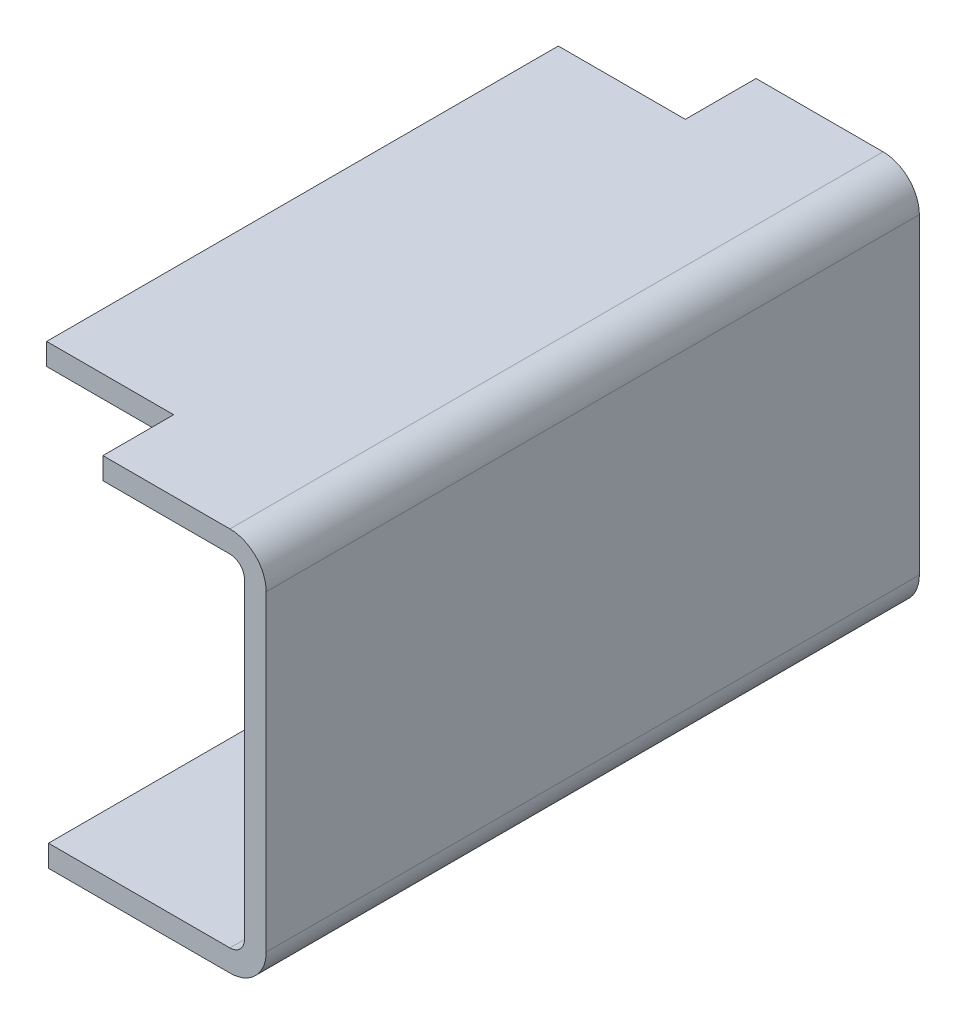
ISO-10303-21;
HEADER;
FILE_DESCRIPTION(('STEP AP214'),'2;1');
FILE_NAME('part.step','',(''),(''),'','','');
FILE_SCHEMA(('AUTOMOTIVE_DESIGN { 1 0 10303 214 1 1 1 1 }'));
ENDSEC;
DATA;
#1=APPLICATION_CONTEXT('core data for automotive mechanical design processes');
#2=APPLICATION_PROTOCOL_DEFINITION('international standard','automotive_design',2000,#1);
#3=PRODUCT_CONTEXT('',#1,'mechanical');
#4=PRODUCT('Part','Part','',(#3));
#5=PRODUCT_RELATED_PRODUCT_CATEGORY('part','',(#4));
#6=PRODUCT_DEFINITION_FORMATION('','',#4);
#7=PRODUCT_DEFINITION_CONTEXT('part definition',#1,'design');
#8=PRODUCT_DEFINITION('design','',#6,#7);
#9=PRODUCT_DEFINITION_SHAPE('','',#8);
#10=(LENGTH_UNIT() NAMED_UNIT(*) SI_UNIT(.MILLI.,.METRE.));
#11=(NAMED_UNIT(*) PLANE_ANGLE_UNIT() SI_UNIT($,.RADIAN.));
#12=(NAMED_UNIT(*) SI_UNIT($,.STERADIAN.) SOLID_ANGLE_UNIT());
#13=UNCERTAINTY_MEASURE_WITH_UNIT(LENGTH_MEASURE(1.E-05),#10,'distance_accuracy_value','');
#14=(GEOMETRIC_REPRESENTATION_CONTEXT(3) GLOBAL_UNCERTAINTY_ASSIGNED_CONTEXT((#13)) GLOBAL_UNIT_ASSIGNED_CONTEXT((#10,
#11,#12)) REPRESENTATION_CONTEXT('',''));
#15=CARTESIAN_POINT('',(0.,0.,0.));
#16=DIRECTION('',(0.,0.,1.));
#17=DIRECTION('',(1.,0.,0.));
#18=AXIS2_PLACEMENT_3D('',#15,#16,#17);
#19=CARTESIAN_POINT('',(3.241785919053,2.18,3.542305203826));
#20=DIRECTION('',(0.,0.,-1.));
#21=DIRECTION('',(0.,1.,0.));
#22=AXIS2_PLACEMENT_3D('',#19,#20,#21);
#23=CYLINDRICAL_SURFACE('',#22,0.05);
#24=CARTESIAN_POINT('',(3.241785919053,2.18,3.542305203826));
#25=DIRECTION('',(0.,0.,-1.));
#26=DIRECTION('',(0.,1.,0.));
#27=AXIS2_PLACEMENT_3D('',#24,#25,#26);
#28=CIRCLE('',#27,0.05);
#29=CARTESIAN_POINT('',(3.241785919053,2.23,3.542305203826));
#30=VERTEX_POINT('',#29);
#31=CARTESIAN_POINT('',(3.291785919053,2.18,3.542305203826));
#32=VERTEX_POINT('',#31);
#33=EDGE_CURVE('E187',#30,#32,#28,.T.);
#34=ORIENTED_EDGE('',*,*,#33,.T.);
#35=DIRECTION('',(0.,0.,-1.));
#36=VECTOR('',#35,1.);
#37=CARTESIAN_POINT('',(3.291785919053,2.18,3.542305203826));
#38=LINE('',#37,#36);
#39=CARTESIAN_POINT('',(3.291785919053,2.18,2.642305203826));
#40=VERTEX_POINT('',#39);
#41=EDGE_CURVE('E11',#32,#40,#38,.T.);
#42=ORIENTED_EDGE('',*,*,#41,.T.);
#43=CARTESIAN_POINT('',(3.241785919053,2.18,2.642305203826));
#44=DIRECTION('',(0.,0.,-1.));
#45=DIRECTION('',(0.,1.,0.));
#46=AXIS2_PLACEMENT_3D('',#43,#44,#45);
#47=CIRCLE('',#46,0.05);
#48=CARTESIAN_POINT('',(3.241785919053,2.23,2.642305203826));
#49=VERTEX_POINT('',#48);
#50=EDGE_CURVE('E258',#49,#40,#47,.T.);
#51=ORIENTED_EDGE('',*,*,#50,.F.);
#52=DIRECTION('',(0.,0.,-1.));
#53=VECTOR('',#52,1.);
#54=CARTESIAN_POINT('',(3.241785919053,2.23,3.542305203826));
#55=LINE('',#54,#53);
#56=EDGE_CURVE('E178',#30,#49,#55,.T.);
#57=ORIENTED_EDGE('',*,*,#56,.F.);
#58=EDGE_LOOP('',(#34,#42,#51,#57));
#59=FACE_BOUND('',#58,.T.);
#60=ADVANCED_FACE('F17',(#59),#23,.T.);
#61=CARTESIAN_POINT('',(3.291785919053,2.18,3.542305203826));
#62=DIRECTION('',(1.,0.,0.));
#63=DIRECTION('',(0.,-1.,0.));
#64=AXIS2_PLACEMENT_3D('',#61,#62,#63);
#65=PLANE('',#64);
#66=DIRECTION('',(0.,-1.,0.));
#67=VECTOR('',#66,1.);
#68=CARTESIAN_POINT('',(3.291785919053,2.18,3.542305203826));
#69=LINE('',#68,#67);
#70=CARTESIAN_POINT('',(3.291785919053,1.75,3.542305203826));
#71=VERTEX_POINT('',#70);
#72=EDGE_CURVE('E206',#32,#71,#69,.T.);
#73=ORIENTED_EDGE('',*,*,#72,.T.);
#74=DIRECTION('',(0.,0.,-1.));
#75=VECTOR('',#74,1.);
#76=CARTESIAN_POINT('',(3.291785919053,1.75,3.542305203826));
#77=LINE('',#76,#75);
#78=CARTESIAN_POINT('',(3.291785919053,1.75,2.642305203826));
#79=VERTEX_POINT('',#78);
#80=EDGE_CURVE('E20',#71,#79,#77,.T.);
#81=ORIENTED_EDGE('',*,*,#80,.T.);
#82=DIRECTION('',(0.,-1.,0.));
#83=VECTOR('',#82,1.);
#84=CARTESIAN_POINT('',(3.291785919053,2.18,2.642305203826));
#85=LINE('',#84,#83);
#86=EDGE_CURVE('E253',#40,#79,#85,.T.);
#87=ORIENTED_EDGE('',*,*,#86,.F.);
#88=ORIENTED_EDGE('',*,*,#41,.F.);
#89=EDGE_LOOP('',(#73,#81,#87,#88));
#90=FACE_BOUND('',#89,.T.);
#91=ADVANCED_FACE('F377',(#90),#65,.T.);
#92=CARTESIAN_POINT('',(3.241785919053,1.75,3.542305203826));
#93=DIRECTION('',(0.,0.,-1.));
#94=DIRECTION('',(1.,0.,0.));
#95=AXIS2_PLACEMENT_3D('',#92,#93,#94);
#96=CYLINDRICAL_SURFACE('',#95,0.05);
#97=CARTESIAN_POINT('',(3.241785919053,1.75,3.542305203826));
#98=DIRECTION('',(0.,0.,-1.));
#99=DIRECTION('',(1.,0.,0.));
#100=AXIS2_PLACEMENT_3D('',#97,#98,#99);
#101=CIRCLE('',#100,0.05);
#102=CARTESIAN_POINT('',(3.241785919053,1.7,3.542305203826));
#103=VERTEX_POINT('',#102);
#104=EDGE_CURVE('E210',#71,#103,#101,.T.);
#105=ORIENTED_EDGE('',*,*,#104,.T.);
#106=DIRECTION('',(0.,0.,-1.));
#107=VECTOR('',#106,1.);
#108=CARTESIAN_POINT('',(3.241785919053,1.7,3.542305203826));
#109=LINE('',#108,#107);
#110=CARTESIAN_POINT('',(3.241785919053,1.7,2.642305203826));
#111=VERTEX_POINT('',#110);
#112=EDGE_CURVE('E262',#103,#111,#109,.T.);
#113=ORIENTED_EDGE('',*,*,#112,.T.);
#114=CARTESIAN_POINT('',(3.241785919053,1.75,2.642305203826));
#115=DIRECTION('',(0.,0.,-1.));
#116=DIRECTION('',(1.,0.,0.));
#117=AXIS2_PLACEMENT_3D('',#114,#115,#116);
#118=CIRCLE('',#117,0.05);
#119=EDGE_CURVE('E257',#79,#111,#118,.T.);
#120=ORIENTED_EDGE('',*,*,#119,.F.);
#121=ORIENTED_EDGE('',*,*,#80,.F.);
#122=EDGE_LOOP('',(#105,#113,#120,#121));
#123=FACE_BOUND('',#122,.T.);
#124=ADVANCED_FACE('F382',(#123),#96,.T.);
#125=CARTESIAN_POINT('',(3.241785919053,1.7,3.542305203826));
#126=DIRECTION('',(0.,-1.,0.));
#127=DIRECTION('',(-1.,0.,0.));
#128=AXIS2_PLACEMENT_3D('',#125,#126,#127);
#129=PLANE('',#128);
#130=DIRECTION('',(-1.,0.,0.));
#131=VECTOR('',#130,1.);
#132=CARTESIAN_POINT('',(3.241785919053,1.7,3.542305203826));
#133=LINE('',#132,#131);
#134=CARTESIAN_POINT('',(2.991785919053,1.7,3.542305203826));
#135=VERTEX_POINT('',#134);
#136=EDGE_CURVE('E215',#103,#135,#133,.T.);
#137=ORIENTED_EDGE('',*,*,#136,.T.);
#138=DIRECTION('',(0.,0.,-1.));
#139=VECTOR('',#138,1.);
#140=CARTESIAN_POINT('',(2.991785919053,1.7,3.542305203826));
#141=LINE('',#140,#139);
#142=CARTESIAN_POINT('',(2.991785919053,1.7,2.642305203826));
#143=VERTEX_POINT('',#142);
#144=EDGE_CURVE('E248',#135,#143,#141,.T.);
#145=ORIENTED_EDGE('',*,*,#144,.T.);
#146=DIRECTION('',(-1.,0.,0.));
#147=VECTOR('',#146,1.);
#148=CARTESIAN_POINT('',(3.241785919053,1.7,2.642305203826));
#149=LINE('',#148,#147);
#150=EDGE_CURVE('E273',#111,#143,#149,.T.);
#151=ORIENTED_EDGE('',*,*,#150,.F.);
#152=ORIENTED_EDGE('',*,*,#112,.F.);
#153=EDGE_LOOP('',(#137,#145,#151,#152));
#154=FACE_BOUND('',#153,.T.);
#155=ADVANCED_FACE('F385',(#154),#129,.T.);
#156=CARTESIAN_POINT('',(2.991785919053,1.7,3.542305203826));
#157=DIRECTION('',(-1.,0.,0.));
#158=DIRECTION('',(0.,0.,1.));
#159=AXIS2_PLACEMENT_3D('',#156,#157,#158);
#160=PLANE('',#159);
#161=DIRECTION('',(0.,1.,0.));
#162=VECTOR('',#161,1.);
#163=CARTESIAN_POINT('',(2.991785919053,1.7,3.542305203826));
#164=LINE('',#163,#162);
#165=CARTESIAN_POINT('',(2.991785919053,1.73,3.542305203826));
#166=VERTEX_POINT('',#165);
#167=EDGE_CURVE('E219',#135,#166,#164,.T.);
#168=ORIENTED_EDGE('',*,*,#167,.T.);
#169=DIRECTION('',(0.,0.,-1.));
#170=VECTOR('',#169,1.);
#171=CARTESIAN_POINT('',(2.991785919053,1.73,3.542305203826));
#172=LINE('',#171,#170);
#173=CARTESIAN_POINT('',(2.991785919053,1.73,2.642305203826));
#174=VERTEX_POINT('',#173);
#175=EDGE_CURVE('E245',#166,#174,#172,.T.);
#176=ORIENTED_EDGE('',*,*,#175,.T.);
#177=DIRECTION('',(0.,1.,0.));
#178=VECTOR('',#177,1.);
#179=CARTESIAN_POINT('',(2.991785919053,1.7,2.642305203826));
#180=LINE('',#179,#178);
#181=EDGE_CURVE('E277',#143,#174,#180,.T.);
#182=ORIENTED_EDGE('',*,*,#181,.F.);
#183=ORIENTED_EDGE('',*,*,#144,.F.);
#184=EDGE_LOOP('',(#168,#176,#182,#183));
#185=FACE_BOUND('',#184,.T.);
#186=ADVANCED_FACE('F388',(#185),#160,.T.);
#187=CARTESIAN_POINT('',(2.991785919053,1.73,3.542305203826));
#188=DIRECTION('',(0.,1.,0.));
#189=DIRECTION('',(1.,0.,0.));
#190=AXIS2_PLACEMENT_3D('',#187,#188,#189);
#191=PLANE('',#190);
#192=DIRECTION('',(1.,0.,0.));
#193=VECTOR('',#192,1.);
#194=CARTESIAN_POINT('',(2.991785919053,1.73,3.542305203826));
#195=LINE('',#194,#193);
#196=CARTESIAN_POINT('',(3.241785919053,1.73,3.542305203826));
#197=VERTEX_POINT('',#196);
#198=EDGE_CURVE('E235',#166,#197,#195,.T.);
#199=ORIENTED_EDGE('',*,*,#198,.T.);
#200=DIRECTION('',(0.,0.,-1.));
#201=VECTOR('',#200,1.);
#202=CARTESIAN_POINT('',(3.241785919053,1.73,3.542305203826));
#203=LINE('',#202,#201);
#204=CARTESIAN_POINT('',(3.241785919053,1.73,2.642305203826));
#205=VERTEX_POINT('',#204);
#206=EDGE_CURVE('E249',#197,#205,#203,.T.);
#207=ORIENTED_EDGE('',*,*,#206,.T.);
#208=DIRECTION('',(1.,0.,0.));
#209=VECTOR('',#208,1.);
#210=CARTESIAN_POINT('',(2.991785919053,1.73,2.642305203826));
#211=LINE('',#210,#209);
#212=EDGE_CURVE('E281',#174,#205,#211,.T.);
#213=ORIENTED_EDGE('',*,*,#212,.F.);
#214=ORIENTED_EDGE('',*,*,#175,.F.);
#215=EDGE_LOOP('',(#199,#207,#213,#214));
#216=FACE_BOUND('',#215,.T.);
#217=ADVANCED_FACE('F362',(#216),#191,.T.);
#218=CARTESIAN_POINT('',(3.241785919053,1.75,3.542305203826));
#219=DIRECTION('',(0.,0.,1.));
#220=DIRECTION('',(0.,-1.,0.));
#221=AXIS2_PLACEMENT_3D('',#218,#219,#220);
#222=CYLINDRICAL_SURFACE('',#221,0.02);
#223=CARTESIAN_POINT('',(3.241785919053,1.75,3.542305203826));
#224=DIRECTION('',(0.,0.,1.));
#225=DIRECTION('',(0.,-1.,0.));
#226=AXIS2_PLACEMENT_3D('',#223,#224,#225);
#227=CIRCLE('',#226,0.02);
#228=CARTESIAN_POINT('',(3.261785919053,1.75,3.542305203826));
#229=VERTEX_POINT('',#228);
#230=EDGE_CURVE('E227',#197,#229,#227,.T.);
#231=ORIENTED_EDGE('',*,*,#230,.T.);
#232=DIRECTION('',(0.,0.,-1.));
#233=VECTOR('',#232,1.);
#234=CARTESIAN_POINT('',(3.261785919053,1.75,3.542305203826));
#235=LINE('',#234,#233);
#236=CARTESIAN_POINT('',(3.261785919053,1.75,2.642305203826));
#237=VERTEX_POINT('',#236);
#238=EDGE_CURVE('E342',#229,#237,#235,.T.);
#239=ORIENTED_EDGE('',*,*,#238,.T.);
#240=CARTESIAN_POINT('',(3.241785919053,1.75,2.642305203826));
#241=DIRECTION('',(0.,0.,1.));
#242=DIRECTION('',(0.,-1.,0.));
#243=AXIS2_PLACEMENT_3D('',#240,#241,#242);
#244=CIRCLE('',#243,0.02);
#245=EDGE_CURVE('E288',#205,#237,#244,.T.);
#246=ORIENTED_EDGE('',*,*,#245,.F.);
#247=ORIENTED_EDGE('',*,*,#206,.F.);
#248=EDGE_LOOP('',(#231,#239,#246,#247));
#249=FACE_BOUND('',#248,.T.);
#250=ADVANCED_FACE('F350',(#249),#222,.F.);
#251=CARTESIAN_POINT('',(3.261785919053,1.75,3.542305203826));
#252=DIRECTION('',(-1.,0.,0.));
#253=DIRECTION('',(0.,0.,1.));
#254=AXIS2_PLACEMENT_3D('',#251,#252,#253);
#255=PLANE('',#254);
#256=DIRECTION('',(0.,1.,0.));
#257=VECTOR('',#256,1.);
#258=CARTESIAN_POINT('',(3.261785919053,1.75,3.542305203826));
#259=LINE('',#258,#257);
#260=CARTESIAN_POINT('',(3.261785919053,2.18,3.542305203826));
#261=VERTEX_POINT('',#260);
#262=EDGE_CURVE('E223',#229,#261,#259,.T.);
#263=ORIENTED_EDGE('',*,*,#262,.T.);
#264=DIRECTION('',(0.,0.,-1.));
#265=VECTOR('',#264,1.);
#266=CARTESIAN_POINT('',(3.261785919053,2.18,3.542305203826));
#267=LINE('',#266,#265);
#268=CARTESIAN_POINT('',(3.261785919053,2.18,2.642305203826));
#269=VERTEX_POINT('',#268);
#270=EDGE_CURVE('E338',#261,#269,#267,.T.);
#271=ORIENTED_EDGE('',*,*,#270,.T.);
#272=DIRECTION('',(0.,1.,0.));
#273=VECTOR('',#272,1.);
#274=CARTESIAN_POINT('',(3.261785919053,1.75,2.642305203826));
#275=LINE('',#274,#273);
#276=EDGE_CURVE('E292',#237,#269,#275,.T.);
#277=ORIENTED_EDGE('',*,*,#276,.F.);
#278=ORIENTED_EDGE('',*,*,#238,.F.);
#279=EDGE_LOOP('',(#263,#271,#277,#278));
#280=FACE_BOUND('',#279,.T.);
#281=ADVANCED_FACE('F354',(#280),#255,.T.);
#282=CARTESIAN_POINT('',(3.241785919053,2.18,3.542305203826));
#283=DIRECTION('',(0.,0.,1.));
#284=DIRECTION('',(1.,0.,0.));
#285=AXIS2_PLACEMENT_3D('',#282,#283,#284);
#286=CYLINDRICAL_SURFACE('',#285,0.02);
#287=CARTESIAN_POINT('',(3.241785919053,2.18,3.542305203826));
#288=DIRECTION('',(0.,0.,1.));
#289=DIRECTION('',(1.,0.,0.));
#290=AXIS2_PLACEMENT_3D('',#287,#288,#289);
#291=CIRCLE('',#290,0.02);
#292=CARTESIAN_POINT('',(3.241785919053,2.2,3.542305203826));
#293=VERTEX_POINT('',#292);
#294=EDGE_CURVE('E202',#261,#293,#291,.T.);
#295=ORIENTED_EDGE('',*,*,#294,.T.);
#296=DIRECTION('',(0.,0.,-1.));
#297=VECTOR('',#296,1.);
#298=CARTESIAN_POINT('',(3.241785919053,2.2,3.542305203826));
#299=LINE('',#298,#297);
#300=CARTESIAN_POINT('',(3.241785919053,2.2,2.642305203826));
#301=VERTEX_POINT('',#300);
#302=EDGE_CURVE('E214',#293,#301,#299,.T.);
#303=ORIENTED_EDGE('',*,*,#302,.T.);
#304=CARTESIAN_POINT('',(3.241785919053,2.18,2.642305203826));
#305=DIRECTION('',(0.,0.,1.));
#306=DIRECTION('',(1.,0.,0.));
#307=AXIS2_PLACEMENT_3D('',#304,#305,#306);
#308=CIRCLE('',#307,0.02);
#309=EDGE_CURVE('E296',#269,#301,#308,.T.);
#310=ORIENTED_EDGE('',*,*,#309,.F.);
#311=ORIENTED_EDGE('',*,*,#270,.F.);
#312=EDGE_LOOP('',(#295,#303,#310,#311));
#313=FACE_BOUND('',#312,.T.);
#314=ADVANCED_FACE('F367',(#313),#286,.F.);
#315=CARTESIAN_POINT('',(1.816785919053,2.2,2.739805203826));
#316=DIRECTION('',(0.,0.,1.));
#317=DIRECTION('',(1.,0.,0.));
#318=AXIS2_PLACEMENT_3D('',#315,#316,#317);
#319=PLANE('',#318);
#320=DIRECTION('',(1.,0.,0.));
#321=VECTOR('',#320,1.);
#322=CARTESIAN_POINT('',(2.891785919053,2.23,2.739805203826));
#323=LINE('',#322,#321);
#324=CARTESIAN_POINT('',(2.891785919053,2.23,2.739805203826));
#325=VERTEX_POINT('',#324);
#326=CARTESIAN_POINT('',(3.066785919053,2.23,2.739805203826));
#327=VERTEX_POINT('',#326);
#328=EDGE_CURVE('E284',#325,#327,#323,.T.);
#329=ORIENTED_EDGE('',*,*,#328,.T.);
#330=DIRECTION('',(0.,1.,0.));
#331=VECTOR('',#330,1.);
#332=CARTESIAN_POINT('',(3.066785919053,2.2,2.739805203826));
#333=LINE('',#332,#331);
#334=CARTESIAN_POINT('',(3.066785919053,2.2,2.739805203826));
#335=VERTEX_POINT('',#334);
#336=EDGE_CURVE('E48',#335,#327,#333,.T.);
#337=ORIENTED_EDGE('',*,*,#336,.F.);
#338=DIRECTION('',(-1.,0.,0.));
#339=VECTOR('',#338,1.);
#340=CARTESIAN_POINT('',(3.066785919053,2.2,2.739805203826));
#341=LINE('',#340,#339);
#342=CARTESIAN_POINT('',(2.891785919053,2.2,2.739805203826));
#343=VERTEX_POINT('',#342);
#344=EDGE_CURVE('E323',#335,#343,#341,.T.);
#345=ORIENTED_EDGE('',*,*,#344,.T.);
#346=DIRECTION('',(0.,1.,0.));
#347=VECTOR('',#346,1.);
#348=CARTESIAN_POINT('',(2.891785919053,2.2,2.739805203826));
#349=LINE('',#348,#347);
#350=EDGE_CURVE('E307',#343,#325,#349,.T.);
#351=ORIENTED_EDGE('',*,*,#350,.T.);
#352=EDGE_LOOP('',(#329,#337,#345,#351));
#353=FACE_BOUND('',#352,.T.);
#354=ADVANCED_FACE('F429',(#353),#319,.F.);
#355=CARTESIAN_POINT('',(3.066785919053,2.2,3.542305203826));
#356=DIRECTION('',(1.,0.,0.));
#357=DIRECTION('',(0.,-1.,0.));
#358=AXIS2_PLACEMENT_3D('',#355,#356,#357);
#359=PLANE('',#358);
#360=DIRECTION('',(0.,0.,-1.));
#361=VECTOR('',#360,1.);
#362=CARTESIAN_POINT('',(3.066785919053,2.23,3.542305203826));
#363=LINE('',#362,#361);
#364=CARTESIAN_POINT('',(3.066785919053,2.23,2.642305203826));
#365=VERTEX_POINT('',#364);
#366=EDGE_CURVE('E239',#327,#365,#363,.T.);
#367=ORIENTED_EDGE('',*,*,#366,.T.);
#368=DIRECTION('',(0.,-1.,0.));
#369=VECTOR('',#368,1.);
#370=CARTESIAN_POINT('',(3.066785919053,2.2,2.642305203826));
#371=LINE('',#370,#369);
#372=CARTESIAN_POINT('',(3.066785919053,2.2,2.642305203826));
#373=VERTEX_POINT('',#372);
#374=EDGE_CURVE('E189',#365,#373,#371,.T.);
#375=ORIENTED_EDGE('',*,*,#374,.T.);
#376=DIRECTION('',(0.,0.,1.));
#377=VECTOR('',#376,1.);
#378=CARTESIAN_POINT('',(3.066785919053,2.2,3.542305203826));
#379=LINE('',#378,#377);
#380=EDGE_CURVE('E326',#373,#335,#379,.T.);
#381=ORIENTED_EDGE('',*,*,#380,.T.);
#382=ORIENTED_EDGE('',*,*,#336,.T.);
#383=EDGE_LOOP('',(#367,#375,#381,#382));
#384=FACE_BOUND('',#383,.T.);
#385=ADVANCED_FACE('F370',(#384),#359,.F.);
#386=CARTESIAN_POINT('',(3.066785919053,2.2,3.542305203826));
#387=DIRECTION('',(1.,0.,0.));
#388=DIRECTION('',(0.,-1.,0.));
#389=AXIS2_PLACEMENT_3D('',#386,#387,#388);
#390=PLANE('',#389);
#391=DIRECTION('',(0.,0.,-1.));
#392=VECTOR('',#391,1.);
#393=CARTESIAN_POINT('',(3.066785919053,2.23,3.542305203826));
#394=LINE('',#393,#392);
#395=CARTESIAN_POINT('',(3.066785919053,2.23,3.542305203826));
#396=VERTEX_POINT('',#395);
#397=CARTESIAN_POINT('',(3.066785919053,2.23,3.444805203826));
#398=VERTEX_POINT('',#397);
#399=EDGE_CURVE('E168',#396,#398,#394,.T.);
#400=ORIENTED_EDGE('',*,*,#399,.T.);
#401=DIRECTION('',(0.,1.,0.));
#402=VECTOR('',#401,1.);
#403=CARTESIAN_POINT('',(3.066785919053,2.2,3.444805203826));
#404=LINE('',#403,#402);
#405=CARTESIAN_POINT('',(3.066785919053,2.2,3.444805203826));
#406=VERTEX_POINT('',#405);
#407=EDGE_CURVE('E38',#406,#398,#404,.T.);
#408=ORIENTED_EDGE('',*,*,#407,.F.);
#409=DIRECTION('',(0.,0.,1.));
#410=VECTOR('',#409,1.);
#411=CARTESIAN_POINT('',(3.066785919053,2.2,3.444805203826));
#412=LINE('',#411,#410);
#413=CARTESIAN_POINT('',(3.066785919053,2.2,3.542305203826));
#414=VERTEX_POINT('',#413);
#415=EDGE_CURVE('E193',#406,#414,#412,.T.);
#416=ORIENTED_EDGE('',*,*,#415,.T.);
#417=DIRECTION('',(0.,-1.,0.));
#418=VECTOR('',#417,1.);
#419=CARTESIAN_POINT('',(3.066785919053,2.23,3.542305203826));
#420=LINE('',#419,#418);
#421=EDGE_CURVE('E184',#396,#414,#420,.T.);
#422=ORIENTED_EDGE('',*,*,#421,.F.);
#423=EDGE_LOOP('',(#400,#408,#416,#422));
#424=FACE_BOUND('',#423,.T.);
#425=ADVANCED_FACE('F191',(#424),#390,.F.);
#426=CARTESIAN_POINT('',(3.066785919053,2.2,3.444805203826));
#427=DIRECTION('',(0.,0.,-1.));
#428=DIRECTION('',(-1.,0.,0.));
#429=AXIS2_PLACEMENT_3D('',#426,#427,#428);
#430=PLANE('',#429);
#431=DIRECTION('',(-1.,0.,0.));
#432=VECTOR('',#431,1.);
#433=CARTESIAN_POINT('',(3.066785919053,2.23,3.444805203826));
#434=LINE('',#433,#432);
#435=CARTESIAN_POINT('',(2.891785919053,2.23,3.444805203826));
#436=VERTEX_POINT('',#435);
#437=EDGE_CURVE('E174',#398,#436,#434,.T.);
#438=ORIENTED_EDGE('',*,*,#437,.T.);
#439=DIRECTION('',(0.,-1.,0.));
#440=VECTOR('',#439,1.);
#441=CARTESIAN_POINT('',(2.891785919053,2.23,3.444805203826));
#442=LINE('',#441,#440);
#443=CARTESIAN_POINT('',(2.891785919053,2.2,3.444805203826));
#444=VERTEX_POINT('',#443);
#445=EDGE_CURVE('E315',#436,#444,#442,.T.);
#446=ORIENTED_EDGE('',*,*,#445,.T.);
#447=DIRECTION('',(1.,0.,0.));
#448=VECTOR('',#447,1.);
#449=CARTESIAN_POINT('',(2.891785919053,2.2,3.444805203826));
#450=LINE('',#449,#448);
#451=EDGE_CURVE('E213',#444,#406,#450,.T.);
#452=ORIENTED_EDGE('',*,*,#451,.T.);
#453=ORIENTED_EDGE('',*,*,#407,.T.);
#454=EDGE_LOOP('',(#438,#446,#452,#453));
#455=FACE_BOUND('',#454,.T.);
#456=ADVANCED_FACE('F418',(#455),#430,.F.);
#457=CARTESIAN_POINT('',(2.891785919053,2.23,3.542305203826));
#458=DIRECTION('',(0.,1.,0.));
#459=DIRECTION('',(1.,0.,0.));
#460=AXIS2_PLACEMENT_3D('',#457,#458,#459);
#461=PLANE('',#460);
#462=ORIENTED_EDGE('',*,*,#328,.F.);
#463=DIRECTION('',(0.,0.,-1.));
#464=VECTOR('',#463,1.);
#465=CARTESIAN_POINT('',(2.891785919053,2.23,3.444805203826));
#466=LINE('',#465,#464);
#467=EDGE_CURVE('E319',#436,#325,#466,.T.);
#468=ORIENTED_EDGE('',*,*,#467,.F.);
#469=ORIENTED_EDGE('',*,*,#437,.F.);
#470=ORIENTED_EDGE('',*,*,#399,.F.);
#471=DIRECTION('',(1.,0.,0.));
#472=VECTOR('',#471,1.);
#473=CARTESIAN_POINT('',(3.066785919053,2.23,3.542305203826));
#474=LINE('',#473,#472);
#475=EDGE_CURVE('E171',#396,#30,#474,.T.);
#476=ORIENTED_EDGE('',*,*,#475,.T.);
#477=ORIENTED_EDGE('',*,*,#56,.T.);
#478=DIRECTION('',(1.,0.,0.));
#479=VECTOR('',#478,1.);
#480=CARTESIAN_POINT('',(3.066785919053,2.23,2.642305203826));
#481=LINE('',#480,#479);
#482=EDGE_CURVE('E231',#365,#49,#481,.T.);
#483=ORIENTED_EDGE('',*,*,#482,.F.);
#484=ORIENTED_EDGE('',*,*,#366,.F.);
#485=EDGE_LOOP('',(#462,#468,#469,#470,#476,#477,#483,#484));
#486=FACE_BOUND('',#485,.T.);
#487=ADVANCED_FACE('F170',(#486),#461,.T.);
#488=CARTESIAN_POINT('',(3.241785919053,2.2,3.542305203826));
#489=DIRECTION('',(0.,-1.,0.));
#490=DIRECTION('',(-1.,0.,0.));
#491=AXIS2_PLACEMENT_3D('',#488,#489,#490);
#492=PLANE('',#491);
#493=ORIENTED_EDGE('',*,*,#344,.F.);
#494=ORIENTED_EDGE('',*,*,#380,.F.);
#495=DIRECTION('',(-1.,0.,0.));
#496=VECTOR('',#495,1.);
#497=CARTESIAN_POINT('',(3.241785919053,2.2,2.642305203826));
#498=LINE('',#497,#496);
#499=EDGE_CURVE('E303',#301,#373,#498,.T.);
#500=ORIENTED_EDGE('',*,*,#499,.F.);
#501=ORIENTED_EDGE('',*,*,#302,.F.);
#502=DIRECTION('',(-1.,0.,0.));
#503=VECTOR('',#502,1.);
#504=CARTESIAN_POINT('',(3.241785919053,2.2,3.542305203826));
#505=LINE('',#504,#503);
#506=EDGE_CURVE('E196',#293,#414,#505,.T.);
#507=ORIENTED_EDGE('',*,*,#506,.T.);
#508=ORIENTED_EDGE('',*,*,#415,.F.);
#509=ORIENTED_EDGE('',*,*,#451,.F.);
#510=DIRECTION('',(0.,0.,-1.));
#511=VECTOR('',#510,1.);
#512=CARTESIAN_POINT('',(2.891785919053,2.2,3.444805203826));
#513=LINE('',#512,#511);
#514=EDGE_CURVE('E311',#444,#343,#513,.T.);
#515=ORIENTED_EDGE('',*,*,#514,.T.);
#516=EDGE_LOOP('',(#493,#494,#500,#501,#507,#508,#509,#515));
#517=FACE_BOUND('',#516,.T.);
#518=ADVANCED_FACE('F419',(#517),#492,.T.);
#519=CARTESIAN_POINT('',(2.891785919053,2.2,3.542305203826));
#520=DIRECTION('',(-1.,0.,0.));
#521=DIRECTION('',(0.,0.,1.));
#522=AXIS2_PLACEMENT_3D('',#519,#520,#521);
#523=PLANE('',#522);
#524=ORIENTED_EDGE('',*,*,#350,.F.);
#525=ORIENTED_EDGE('',*,*,#514,.F.);
#526=ORIENTED_EDGE('',*,*,#445,.F.);
#527=ORIENTED_EDGE('',*,*,#467,.T.);
#528=EDGE_LOOP('',(#524,#525,#526,#527));
#529=FACE_BOUND('',#528,.T.);
#530=ADVANCED_FACE('F422',(#529),#523,.T.);
#531=CARTESIAN_POINT('',(2.441785919053,1.7,2.642305203826));
#532=DIRECTION('',(0.,0.,-1.));
#533=DIRECTION('',(-1.,0.,0.));
#534=AXIS2_PLACEMENT_3D('',#531,#532,#533);
#535=PLANE('',#534);
#536=ORIENTED_EDGE('',*,*,#374,.F.);
#537=ORIENTED_EDGE('',*,*,#482,.T.);
#538=ORIENTED_EDGE('',*,*,#50,.T.);
#539=ORIENTED_EDGE('',*,*,#86,.T.);
#540=ORIENTED_EDGE('',*,*,#119,.T.);
#541=ORIENTED_EDGE('',*,*,#150,.T.);
#542=ORIENTED_EDGE('',*,*,#181,.T.);
#543=ORIENTED_EDGE('',*,*,#212,.T.);
#544=ORIENTED_EDGE('',*,*,#245,.T.);
#545=ORIENTED_EDGE('',*,*,#276,.T.);
#546=ORIENTED_EDGE('',*,*,#309,.T.);
#547=ORIENTED_EDGE('',*,*,#499,.T.);
#548=EDGE_LOOP('',(#536,#537,#538,#539,#540,#541,#542,#543,#544,#545,#546,#547));
#549=FACE_BOUND('',#548,.T.);
#550=ADVANCED_FACE('F358',(#549),#535,.T.);
#551=CARTESIAN_POINT('',(2.441785919053,1.7,3.542305203826));
#552=DIRECTION('',(0.,0.,-1.));
#553=DIRECTION('',(-1.,0.,0.));
#554=AXIS2_PLACEMENT_3D('',#551,#552,#553);
#555=PLANE('',#554);
#556=ORIENTED_EDGE('',*,*,#421,.T.);
#557=ORIENTED_EDGE('',*,*,#506,.F.);
#558=ORIENTED_EDGE('',*,*,#294,.F.);
#559=ORIENTED_EDGE('',*,*,#262,.F.);
#560=ORIENTED_EDGE('',*,*,#230,.F.);
#561=ORIENTED_EDGE('',*,*,#198,.F.);
#562=ORIENTED_EDGE('',*,*,#167,.F.);
#563=ORIENTED_EDGE('',*,*,#136,.F.);
#564=ORIENTED_EDGE('',*,*,#104,.F.);
#565=ORIENTED_EDGE('',*,*,#72,.F.);
#566=ORIENTED_EDGE('',*,*,#33,.F.);
#567=ORIENTED_EDGE('',*,*,#475,.F.);
#568=EDGE_LOOP('',(#556,#557,#558,#559,#560,#561,#562,#563,#564,#565,#566,#567));
#569=FACE_BOUND('',#568,.T.);
#570=ADVANCED_FACE('F182',(#569),#555,.F.);
#571=CLOSED_SHELL('',(#60,#91,#124,#155,#186,#217,#250,#281,#314,#354,#385,#425,#456,#487,#518,
#530,#550,#570));
#572=MANIFOLD_SOLID_BREP('B1',#571);
#573=ADVANCED_BREP_SHAPE_REPRESENTATION('',(#18,#572),#14);
#574=SHAPE_DEFINITION_REPRESENTATION(#9,#573);
ENDSEC;
END-ISO-10303-21;
